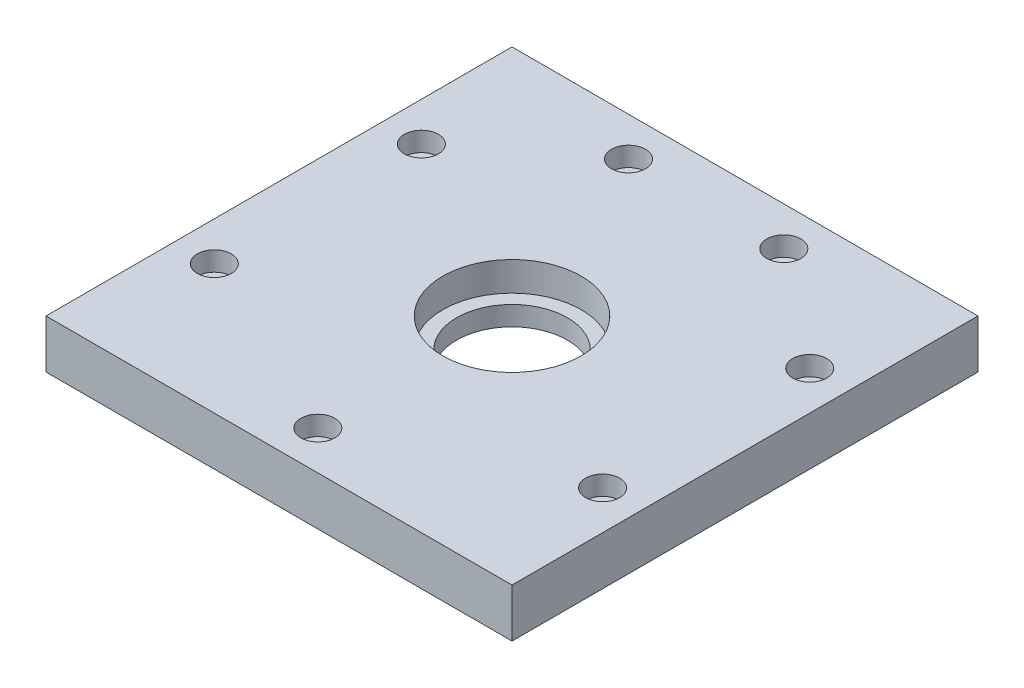
ISO-10303-21;
HEADER;
FILE_DESCRIPTION(('STEP AP214'),'2;1');
FILE_NAME('part.step','',(''),(''),'','','');
FILE_SCHEMA(('AUTOMOTIVE_DESIGN { 1 0 10303 214 1 1 1 1 }'));
ENDSEC;
DATA;
#1=APPLICATION_CONTEXT('core data for automotive mechanical design processes');
#2=APPLICATION_PROTOCOL_DEFINITION('international standard','automotive_design',2000,#1);
#3=PRODUCT_CONTEXT('',#1,'mechanical');
#4=PRODUCT('Part','Part','',(#3));
#5=PRODUCT_RELATED_PRODUCT_CATEGORY('part','',(#4));
#6=PRODUCT_DEFINITION_FORMATION('','',#4);
#7=PRODUCT_DEFINITION_CONTEXT('part definition',#1,'design');
#8=PRODUCT_DEFINITION('design','',#6,#7);
#9=PRODUCT_DEFINITION_SHAPE('','',#8);
#10=(LENGTH_UNIT() NAMED_UNIT(*) SI_UNIT(.MILLI.,.METRE.));
#11=(NAMED_UNIT(*) PLANE_ANGLE_UNIT() SI_UNIT($,.RADIAN.));
#12=(NAMED_UNIT(*) SI_UNIT($,.STERADIAN.) SOLID_ANGLE_UNIT());
#13=UNCERTAINTY_MEASURE_WITH_UNIT(LENGTH_MEASURE(1.E-05),#10,'distance_accuracy_value','');
#14=(GEOMETRIC_REPRESENTATION_CONTEXT(3) GLOBAL_UNCERTAINTY_ASSIGNED_CONTEXT((#13)) GLOBAL_UNIT_ASSIGNED_CONTEXT((#10,
#11,#12)) REPRESENTATION_CONTEXT('',''));
#15=CARTESIAN_POINT('',(0.,0.,0.));
#16=DIRECTION('',(0.,0.,1.));
#17=DIRECTION('',(1.,0.,0.));
#18=AXIS2_PLACEMENT_3D('',#15,#16,#17);
#19=CARTESIAN_POINT('',(-76.2,7.9375,76.2));
#20=DIRECTION('',(0.,-1.,0.));
#21=DIRECTION('',(0.,0.,-1.));
#22=AXIS2_PLACEMENT_3D('',#19,#20,#21);
#23=PLANE('',#22);
#24=CARTESIAN_POINT('',(-63.5,7.9375,-33.8666666666667));
#25=DIRECTION('',(0.,1.,0.));
#26=DIRECTION('',(0.,0.,1.));
#27=AXIS2_PLACEMENT_3D('',#24,#25,#26);
#28=CIRCLE('',#27,5.55625);
#29=CARTESIAN_POINT('',(-63.5,7.9375,-28.3104166666667));
#30=VERTEX_POINT('',#29);
#31=EDGE_CURVE('E210',#30,#30,#28,.T.);
#32=ORIENTED_EDGE('',*,*,#31,.F.);
#33=EDGE_LOOP('',(#32));
#34=FACE_BOUND('',#33,.T.);
#35=CARTESIAN_POINT('',(-25.4,7.9375,-63.5));
#36=DIRECTION('',(0.,1.,0.));
#37=DIRECTION('',(0.,0.,1.));
#38=AXIS2_PLACEMENT_3D('',#35,#36,#37);
#39=CIRCLE('',#38,5.55625);
#40=CARTESIAN_POINT('',(-25.4,7.9375,-57.94375));
#41=VERTEX_POINT('',#40);
#42=EDGE_CURVE('E198',#41,#41,#39,.T.);
#43=ORIENTED_EDGE('',*,*,#42,.F.);
#44=EDGE_LOOP('',(#43));
#45=FACE_BOUND('',#44,.T.);
#46=CARTESIAN_POINT('',(25.4,7.9375,-63.5));
#47=DIRECTION('',(0.,1.,0.));
#48=DIRECTION('',(0.,0.,1.));
#49=AXIS2_PLACEMENT_3D('',#46,#47,#48);
#50=CIRCLE('',#49,5.55625);
#51=CARTESIAN_POINT('',(25.4,7.9375,-57.94375));
#52=VERTEX_POINT('',#51);
#53=EDGE_CURVE('E186',#52,#52,#50,.T.);
#54=ORIENTED_EDGE('',*,*,#53,.F.);
#55=EDGE_LOOP('',(#54));
#56=FACE_BOUND('',#55,.T.);
#57=CARTESIAN_POINT('',(63.5,7.9375,-33.8666666666667));
#58=DIRECTION('',(0.,1.,0.));
#59=DIRECTION('',(0.,0.,1.));
#60=AXIS2_PLACEMENT_3D('',#57,#58,#59);
#61=CIRCLE('',#60,5.55625);
#62=CARTESIAN_POINT('',(63.5,7.9375,-28.3104166666667));
#63=VERTEX_POINT('',#62);
#64=EDGE_CURVE('E174',#63,#63,#61,.T.);
#65=ORIENTED_EDGE('',*,*,#64,.F.);
#66=EDGE_LOOP('',(#65));
#67=FACE_BOUND('',#66,.T.);
#68=CARTESIAN_POINT('',(63.5,7.9375,33.8666666666667));
#69=DIRECTION('',(0.,1.,0.));
#70=DIRECTION('',(0.,0.,1.));
#71=AXIS2_PLACEMENT_3D('',#68,#69,#70);
#72=CIRCLE('',#71,5.55625);
#73=CARTESIAN_POINT('',(63.5,7.9375,39.4229166666667));
#74=VERTEX_POINT('',#73);
#75=EDGE_CURVE('E162',#74,#74,#72,.T.);
#76=ORIENTED_EDGE('',*,*,#75,.F.);
#77=EDGE_LOOP('',(#76));
#78=FACE_BOUND('',#77,.T.);
#79=CARTESIAN_POINT('',(0.,7.9375,63.5));
#80=DIRECTION('',(0.,1.,0.));
#81=DIRECTION('',(0.,0.,1.));
#82=AXIS2_PLACEMENT_3D('',#79,#80,#81);
#83=CIRCLE('',#82,5.55625);
#84=CARTESIAN_POINT('',(0.,7.9375,69.05625));
#85=VERTEX_POINT('',#84);
#86=EDGE_CURVE('E150',#85,#85,#83,.T.);
#87=ORIENTED_EDGE('',*,*,#86,.F.);
#88=EDGE_LOOP('',(#87));
#89=FACE_BOUND('',#88,.T.);
#90=CARTESIAN_POINT('',(0.,7.9375,0.));
#91=DIRECTION('',(0.,1.,0.));
#92=DIRECTION('',(0.,0.,1.));
#93=AXIS2_PLACEMENT_3D('',#90,#91,#92);
#94=CIRCLE('',#93,22.621875);
#95=CARTESIAN_POINT('',(0.,7.9375,22.621875));
#96=VERTEX_POINT('',#95);
#97=EDGE_CURVE('E118',#96,#96,#94,.T.);
#98=ORIENTED_EDGE('',*,*,#97,.F.);
#99=EDGE_LOOP('',(#98));
#100=FACE_BOUND('',#99,.T.);
#101=DIRECTION('',(-1.,0.,0.));
#102=VECTOR('',#101,1.);
#103=CARTESIAN_POINT('',(-76.2,7.9375,-76.2));
#104=LINE('',#103,#102);
#105=CARTESIAN_POINT('',(76.2,7.9375,-76.2));
#106=VERTEX_POINT('',#105);
#107=CARTESIAN_POINT('',(-76.2,7.9375,-76.2));
#108=VERTEX_POINT('',#107);
#109=EDGE_CURVE('E80',#106,#108,#104,.T.);
#110=ORIENTED_EDGE('',*,*,#109,.T.);
#111=DIRECTION('',(0.,0.,-1.));
#112=VECTOR('',#111,1.);
#113=CARTESIAN_POINT('',(-76.2,7.9375,76.2));
#114=LINE('',#113,#112);
#115=CARTESIAN_POINT('',(-76.2,7.9375,76.2));
#116=VERTEX_POINT('',#115);
#117=EDGE_CURVE('E100',#116,#108,#114,.T.);
#118=ORIENTED_EDGE('',*,*,#117,.F.);
#119=DIRECTION('',(-1.,0.,0.));
#120=VECTOR('',#119,1.);
#121=CARTESIAN_POINT('',(-76.2,7.9375,76.2));
#122=LINE('',#121,#120);
#123=CARTESIAN_POINT('',(76.2,7.9375,76.2));
#124=VERTEX_POINT('',#123);
#125=EDGE_CURVE('E57',#124,#116,#122,.T.);
#126=ORIENTED_EDGE('',*,*,#125,.F.);
#127=DIRECTION('',(0.,0.,-1.));
#128=VECTOR('',#127,1.);
#129=CARTESIAN_POINT('',(76.2,7.9375,76.2));
#130=LINE('',#129,#128);
#131=EDGE_CURVE('E97',#124,#106,#130,.T.);
#132=ORIENTED_EDGE('',*,*,#131,.T.);
#133=EDGE_LOOP('',(#110,#118,#126,#132));
#134=FACE_BOUND('',#133,.T.);
#135=CARTESIAN_POINT('',(-63.5,7.9375,33.8666666666667));
#136=DIRECTION('',(0.,1.,0.));
#137=DIRECTION('',(0.,0.,1.));
#138=AXIS2_PLACEMENT_3D('',#135,#136,#137);
#139=CIRCLE('',#138,5.55625);
#140=CARTESIAN_POINT('',(-63.5,7.9375,39.4229166666667));
#141=VERTEX_POINT('',#140);
#142=EDGE_CURVE('E138',#141,#141,#139,.T.);
#143=ORIENTED_EDGE('',*,*,#142,.F.);
#144=EDGE_LOOP('',(#143));
#145=FACE_BOUND('',#144,.T.);
#146=ADVANCED_FACE('F40',(#34,#45,#56,#67,#78,#89,#100,#134,#145),#23,.F.);
#147=CARTESIAN_POINT('',(-76.2,-7.9375,76.2));
#148=DIRECTION('',(1.,0.,0.));
#149=DIRECTION('',(0.,0.,-1.));
#150=AXIS2_PLACEMENT_3D('',#147,#148,#149);
#151=PLANE('',#150);
#152=DIRECTION('',(0.,-1.,0.));
#153=VECTOR('',#152,1.);
#154=CARTESIAN_POINT('',(-76.2,-7.9375,-76.2));
#155=LINE('',#154,#153);
#156=CARTESIAN_POINT('',(-76.2,-7.9375,-76.2));
#157=VERTEX_POINT('',#156);
#158=EDGE_CURVE('E104',#108,#157,#155,.T.);
#159=ORIENTED_EDGE('',*,*,#158,.T.);
#160=DIRECTION('',(0.,0.,-1.));
#161=VECTOR('',#160,1.);
#162=CARTESIAN_POINT('',(-76.2,-7.9375,76.2));
#163=LINE('',#162,#161);
#164=CARTESIAN_POINT('',(-76.2,-7.9375,76.2));
#165=VERTEX_POINT('',#164);
#166=EDGE_CURVE('E11',#165,#157,#163,.T.);
#167=ORIENTED_EDGE('',*,*,#166,.F.);
#168=DIRECTION('',(0.,-1.,0.));
#169=VECTOR('',#168,1.);
#170=CARTESIAN_POINT('',(-76.2,-7.9375,76.2));
#171=LINE('',#170,#169);
#172=EDGE_CURVE('E92',#116,#165,#171,.T.);
#173=ORIENTED_EDGE('',*,*,#172,.F.);
#174=ORIENTED_EDGE('',*,*,#117,.T.);
#175=EDGE_LOOP('',(#159,#167,#173,#174));
#176=FACE_BOUND('',#175,.T.);
#177=ADVANCED_FACE('F42',(#176),#151,.F.);
#178=CARTESIAN_POINT('',(76.2,-7.9375,76.2));
#179=DIRECTION('',(0.,1.,0.));
#180=DIRECTION('',(0.,0.,1.));
#181=AXIS2_PLACEMENT_3D('',#178,#179,#180);
#182=PLANE('',#181);
#183=CARTESIAN_POINT('',(-63.5,-7.9375,-33.8666666666667));
#184=DIRECTION('',(0.,1.,0.));
#185=DIRECTION('',(0.,0.,1.));
#186=AXIS2_PLACEMENT_3D('',#183,#184,#185);
#187=CIRCLE('',#186,3.3782);
#188=CARTESIAN_POINT('',(-63.5,-7.9375,-30.4884666666667));
#189=VERTEX_POINT('',#188);
#190=EDGE_CURVE('E201',#189,#189,#187,.T.);
#191=ORIENTED_EDGE('',*,*,#190,.T.);
#192=EDGE_LOOP('',(#191));
#193=FACE_BOUND('',#192,.T.);
#194=CARTESIAN_POINT('',(-25.4,-7.9375,-63.5));
#195=DIRECTION('',(0.,1.,0.));
#196=DIRECTION('',(0.,0.,1.));
#197=AXIS2_PLACEMENT_3D('',#194,#195,#196);
#198=CIRCLE('',#197,3.3782);
#199=CARTESIAN_POINT('',(-25.4,-7.9375,-60.1218));
#200=VERTEX_POINT('',#199);
#201=EDGE_CURVE('E189',#200,#200,#198,.T.);
#202=ORIENTED_EDGE('',*,*,#201,.T.);
#203=EDGE_LOOP('',(#202));
#204=FACE_BOUND('',#203,.T.);
#205=CARTESIAN_POINT('',(25.4,-7.9375,-63.5));
#206=DIRECTION('',(0.,1.,0.));
#207=DIRECTION('',(0.,0.,1.));
#208=AXIS2_PLACEMENT_3D('',#205,#206,#207);
#209=CIRCLE('',#208,3.3782);
#210=CARTESIAN_POINT('',(25.4,-7.9375,-60.1218));
#211=VERTEX_POINT('',#210);
#212=EDGE_CURVE('E177',#211,#211,#209,.T.);
#213=ORIENTED_EDGE('',*,*,#212,.T.);
#214=EDGE_LOOP('',(#213));
#215=FACE_BOUND('',#214,.T.);
#216=CARTESIAN_POINT('',(63.5,-7.9375,-33.8666666666667));
#217=DIRECTION('',(0.,1.,0.));
#218=DIRECTION('',(0.,0.,1.));
#219=AXIS2_PLACEMENT_3D('',#216,#217,#218);
#220=CIRCLE('',#219,3.3782);
#221=CARTESIAN_POINT('',(63.5,-7.9375,-30.4884666666667));
#222=VERTEX_POINT('',#221);
#223=EDGE_CURVE('E165',#222,#222,#220,.T.);
#224=ORIENTED_EDGE('',*,*,#223,.T.);
#225=EDGE_LOOP('',(#224));
#226=FACE_BOUND('',#225,.T.);
#227=CARTESIAN_POINT('',(63.5,-7.9375,33.8666666666667));
#228=DIRECTION('',(0.,1.,0.));
#229=DIRECTION('',(0.,0.,1.));
#230=AXIS2_PLACEMENT_3D('',#227,#228,#229);
#231=CIRCLE('',#230,3.3782);
#232=CARTESIAN_POINT('',(63.5,-7.9375,37.2448666666667));
#233=VERTEX_POINT('',#232);
#234=EDGE_CURVE('E153',#233,#233,#231,.T.);
#235=ORIENTED_EDGE('',*,*,#234,.T.);
#236=EDGE_LOOP('',(#235));
#237=FACE_BOUND('',#236,.T.);
#238=CARTESIAN_POINT('',(0.,-7.9375,63.5));
#239=DIRECTION('',(0.,1.,0.));
#240=DIRECTION('',(0.,0.,1.));
#241=AXIS2_PLACEMENT_3D('',#238,#239,#240);
#242=CIRCLE('',#241,3.3782);
#243=CARTESIAN_POINT('',(0.,-7.9375,66.8782));
#244=VERTEX_POINT('',#243);
#245=EDGE_CURVE('E141',#244,#244,#242,.T.);
#246=ORIENTED_EDGE('',*,*,#245,.T.);
#247=EDGE_LOOP('',(#246));
#248=FACE_BOUND('',#247,.T.);
#249=CARTESIAN_POINT('',(-63.5,-7.9375,33.8666666666667));
#250=DIRECTION('',(0.,1.,0.));
#251=DIRECTION('',(0.,0.,1.));
#252=AXIS2_PLACEMENT_3D('',#249,#250,#251);
#253=CIRCLE('',#252,3.3782);
#254=CARTESIAN_POINT('',(-63.5,-7.9375,37.2448666666667));
#255=VERTEX_POINT('',#254);
#256=EDGE_CURVE('E127',#255,#255,#253,.T.);
#257=ORIENTED_EDGE('',*,*,#256,.T.);
#258=EDGE_LOOP('',(#257));
#259=FACE_BOUND('',#258,.T.);
#260=CARTESIAN_POINT('',(0.,-7.9375,0.));
#261=DIRECTION('',(0.,1.,0.));
#262=DIRECTION('',(0.,0.,1.));
#263=AXIS2_PLACEMENT_3D('',#260,#261,#262);
#264=CIRCLE('',#263,18.0975);
#265=CARTESIAN_POINT('',(0.,-7.9375,18.0975));
#266=VERTEX_POINT('',#265);
#267=EDGE_CURVE('E121',#266,#266,#264,.T.);
#268=ORIENTED_EDGE('',*,*,#267,.T.);
#269=EDGE_LOOP('',(#268));
#270=FACE_BOUND('',#269,.T.);
#271=DIRECTION('',(1.,0.,0.));
#272=VECTOR('',#271,1.);
#273=CARTESIAN_POINT('',(76.2,-7.9375,-76.2));
#274=LINE('',#273,#272);
#275=CARTESIAN_POINT('',(76.2,-7.9375,-76.2));
#276=VERTEX_POINT('',#275);
#277=EDGE_CURVE('E96',#157,#276,#274,.T.);
#278=ORIENTED_EDGE('',*,*,#277,.T.);
#279=DIRECTION('',(0.,0.,-1.));
#280=VECTOR('',#279,1.);
#281=CARTESIAN_POINT('',(76.2,-7.9375,76.2));
#282=LINE('',#281,#280);
#283=CARTESIAN_POINT('',(76.2,-7.9375,76.2));
#284=VERTEX_POINT('',#283);
#285=EDGE_CURVE('E49',#284,#276,#282,.T.);
#286=ORIENTED_EDGE('',*,*,#285,.F.);
#287=DIRECTION('',(1.,0.,0.));
#288=VECTOR('',#287,1.);
#289=CARTESIAN_POINT('',(76.2,-7.9375,76.2));
#290=LINE('',#289,#288);
#291=EDGE_CURVE('E87',#165,#284,#290,.T.);
#292=ORIENTED_EDGE('',*,*,#291,.F.);
#293=ORIENTED_EDGE('',*,*,#166,.T.);
#294=EDGE_LOOP('',(#278,#286,#292,#293));
#295=FACE_BOUND('',#294,.T.);
#296=ADVANCED_FACE('F95',(#193,#204,#215,#226,#237,#248,#259,#270,#295),#182,.F.);
#297=CARTESIAN_POINT('',(76.2,7.9375,76.2));
#298=DIRECTION('',(-1.,0.,0.));
#299=DIRECTION('',(0.,0.,1.));
#300=AXIS2_PLACEMENT_3D('',#297,#298,#299);
#301=PLANE('',#300);
#302=DIRECTION('',(0.,1.,0.));
#303=VECTOR('',#302,1.);
#304=CARTESIAN_POINT('',(76.2,7.9375,-76.2));
#305=LINE('',#304,#303);
#306=EDGE_CURVE('E74',#276,#106,#305,.T.);
#307=ORIENTED_EDGE('',*,*,#306,.T.);
#308=ORIENTED_EDGE('',*,*,#131,.F.);
#309=DIRECTION('',(0.,1.,0.));
#310=VECTOR('',#309,1.);
#311=CARTESIAN_POINT('',(76.2,7.9375,76.2));
#312=LINE('',#311,#310);
#313=EDGE_CURVE('E90',#284,#124,#312,.T.);
#314=ORIENTED_EDGE('',*,*,#313,.F.);
#315=ORIENTED_EDGE('',*,*,#285,.T.);
#316=EDGE_LOOP('',(#307,#308,#314,#315));
#317=FACE_BOUND('',#316,.T.);
#318=ADVANCED_FACE('F98',(#317),#301,.F.);
#319=CARTESIAN_POINT('',(0.,0.,76.2));
#320=DIRECTION('',(0.,0.,-1.));
#321=DIRECTION('',(-1.,0.,0.));
#322=AXIS2_PLACEMENT_3D('',#319,#320,#321);
#323=PLANE('',#322);
#324=ORIENTED_EDGE('',*,*,#172,.T.);
#325=ORIENTED_EDGE('',*,*,#291,.T.);
#326=ORIENTED_EDGE('',*,*,#313,.T.);
#327=ORIENTED_EDGE('',*,*,#125,.T.);
#328=EDGE_LOOP('',(#324,#325,#326,#327));
#329=FACE_BOUND('',#328,.T.);
#330=ADVANCED_FACE('F88',(#329),#323,.F.);
#331=CARTESIAN_POINT('',(0.,0.,-76.2));
#332=DIRECTION('',(0.,0.,-1.));
#333=DIRECTION('',(-1.,0.,0.));
#334=AXIS2_PLACEMENT_3D('',#331,#332,#333);
#335=PLANE('',#334);
#336=ORIENTED_EDGE('',*,*,#158,.F.);
#337=ORIENTED_EDGE('',*,*,#109,.F.);
#338=ORIENTED_EDGE('',*,*,#306,.F.);
#339=ORIENTED_EDGE('',*,*,#277,.F.);
#340=EDGE_LOOP('',(#336,#337,#338,#339));
#341=FACE_BOUND('',#340,.T.);
#342=ADVANCED_FACE('F115',(#341),#335,.T.);
#343=CARTESIAN_POINT('',(0.,-1.5875,0.));
#344=DIRECTION('',(0.,1.,0.));
#345=DIRECTION('',(0.,0.,1.));
#346=AXIS2_PLACEMENT_3D('',#343,#344,#345);
#347=CYLINDRICAL_SURFACE('',#346,22.621875);
#348=CARTESIAN_POINT('',(0.,-1.5875,0.));
#349=DIRECTION('',(0.,1.,0.));
#350=DIRECTION('',(0.,0.,1.));
#351=AXIS2_PLACEMENT_3D('',#348,#349,#350);
#352=CIRCLE('',#351,22.621875);
#353=CARTESIAN_POINT('',(0.,-1.5875,22.621875));
#354=VERTEX_POINT('',#353);
#355=EDGE_CURVE('E107',#354,#354,#352,.T.);
#356=CARTESIAN_POINT('',(0.,-1.5875,22.621875));
#357=CARTESIAN_POINT('',(0.,-1.48828125,22.621875));
#358=CARTESIAN_POINT('',(0.,-1.3890625,22.621875));
#359=CARTESIAN_POINT('',(0.,-1.190625,22.621875));
#360=CARTESIAN_POINT('',(0.,-1.09140625,22.621875));
#361=CARTESIAN_POINT('',(0.,-0.892968749999999,22.621875));
#362=CARTESIAN_POINT('',(0.,-0.793749999999999,22.621875));
#363=CARTESIAN_POINT('',(0.,-0.595312499999999,22.621875));
#364=CARTESIAN_POINT('',(0.,-0.496093749999999,22.621875));
#365=CARTESIAN_POINT('',(0.,-0.297656249999999,22.621875));
#366=CARTESIAN_POINT('',(0.,-0.198437499999998,22.621875));
#367=CARTESIAN_POINT('',(0.,0.,22.621875));
#368=CARTESIAN_POINT('',(0.,0.0992187500000016,22.621875));
#369=CARTESIAN_POINT('',(0.,0.297656250000001,22.621875));
#370=CARTESIAN_POINT('',(0.,0.396875000000001,22.621875));
#371=CARTESIAN_POINT('',(0.,0.595312500000001,22.621875));
#372=CARTESIAN_POINT('',(0.,0.694531250000001,22.621875));
#373=CARTESIAN_POINT('',(0.,0.892968750000002,22.621875));
#374=CARTESIAN_POINT('',(0.,0.992187500000002,22.621875));
#375=CARTESIAN_POINT('',(0.,1.190625,22.621875));
#376=CARTESIAN_POINT('',(0.,1.28984375,22.621875));
#377=CARTESIAN_POINT('',(0.,1.48828125,22.621875));
#378=CARTESIAN_POINT('',(0.,1.5875,22.621875));
#379=CARTESIAN_POINT('',(0.,1.7859375,22.621875));
#380=CARTESIAN_POINT('',(0.,1.88515625,22.621875));
#381=CARTESIAN_POINT('',(0.,2.08359375,22.621875));
#382=CARTESIAN_POINT('',(0.,2.1828125,22.621875));
#383=CARTESIAN_POINT('',(0.,2.38125,22.621875));
#384=CARTESIAN_POINT('',(0.,2.48046875,22.621875));
#385=CARTESIAN_POINT('',(0.,2.67890625,22.621875));
#386=CARTESIAN_POINT('',(0.,2.778125,22.621875));
#387=CARTESIAN_POINT('',(0.,2.9765625,22.621875));
#388=CARTESIAN_POINT('',(0.,3.07578125,22.621875));
#389=CARTESIAN_POINT('',(0.,3.27421875,22.621875));
#390=CARTESIAN_POINT('',(0.,3.3734375,22.621875));
#391=CARTESIAN_POINT('',(0.,3.571875,22.621875));
#392=CARTESIAN_POINT('',(0.,3.67109375,22.621875));
#393=CARTESIAN_POINT('',(0.,3.86953125,22.621875));
#394=CARTESIAN_POINT('',(0.,3.96875,22.621875));
#395=CARTESIAN_POINT('',(0.,4.1671875,22.621875));
#396=CARTESIAN_POINT('',(0.,4.26640625,22.621875));
#397=CARTESIAN_POINT('',(0.,4.46484375,22.621875));
#398=CARTESIAN_POINT('',(0.,4.5640625,22.621875));
#399=CARTESIAN_POINT('',(0.,4.7625,22.621875));
#400=CARTESIAN_POINT('',(0.,4.86171875,22.621875));
#401=CARTESIAN_POINT('',(0.,5.06015625,22.621875));
#402=CARTESIAN_POINT('',(0.,5.159375,22.621875));
#403=CARTESIAN_POINT('',(0.,5.3578125,22.621875));
#404=CARTESIAN_POINT('',(0.,5.45703125,22.621875));
#405=CARTESIAN_POINT('',(0.,5.65546875,22.621875));
#406=CARTESIAN_POINT('',(0.,5.7546875,22.621875));
#407=CARTESIAN_POINT('',(0.,5.953125,22.621875));
#408=CARTESIAN_POINT('',(0.,6.05234375,22.621875));
#409=CARTESIAN_POINT('',(0.,6.25078125,22.621875));
#410=CARTESIAN_POINT('',(0.,6.35,22.621875));
#411=CARTESIAN_POINT('',(0.,6.5484375,22.621875));
#412=CARTESIAN_POINT('',(0.,6.64765625,22.621875));
#413=CARTESIAN_POINT('',(0.,6.84609375,22.621875));
#414=CARTESIAN_POINT('',(0.,6.9453125,22.621875));
#415=CARTESIAN_POINT('',(0.,7.14375,22.621875));
#416=CARTESIAN_POINT('',(0.,7.24296875,22.621875));
#417=CARTESIAN_POINT('',(0.,7.44140625,22.621875));
#418=CARTESIAN_POINT('',(0.,7.540625,22.621875));
#419=CARTESIAN_POINT('',(0.,7.7390625,22.621875));
#420=CARTESIAN_POINT('',(0.,7.83828125,22.621875));
#421=CARTESIAN_POINT('',(0.,7.9375,22.621875));
#422=B_SPLINE_CURVE_WITH_KNOTS('',3,(#356,#357,#358,#359,#360,#361,#362,#363,#364,#365,#366,
#367,#368,#369,#370,#371,#372,#373,#374,#375,#376,#377,#378,#379,#380,#381,#382,#383,#384,#385,
#386,#387,#388,#389,#390,#391,#392,#393,#394,#395,#396,#397,#398,#399,#400,#401,#402,#403,#404,
#405,#406,#407,#408,#409,#410,#411,#412,#413,#414,#415,#416,#417,#418,#419,#420,#421),
.UNSPECIFIED.,.F.,.F.,(4,2,2,2,2,2,2,2,2,2,2,2,2,2,2,2,2,2,2,2,2,2,2,2,2,2,2,2,2,2,2,2,4),(0.,
0.29765625,0.5953125,0.89296875,1.190625,1.48828125,1.7859375,2.08359375,2.38125,2.67890625,
2.9765625,3.27421875,3.571875,3.86953125,4.1671875,4.46484375,4.7625,5.06015625,5.3578125,
5.65546875,5.953125,6.25078125,6.5484375,6.84609375,7.14375,7.44140625,7.7390625,8.03671875,
8.334375,8.63203125,8.9296875,9.22734375,9.525),.UNSPECIFIED.);
#423=EDGE_CURVE('BSEAM231',#354,#96,#422,.T.);
#424=ORIENTED_EDGE('',*,*,#355,.F.);
#425=ORIENTED_EDGE('',*,*,#97,.T.);
#426=ORIENTED_EDGE('',*,*,#423,.T.);
#427=ORIENTED_EDGE('',*,*,#423,.F.);
#428=EDGE_LOOP('',(#424,#426,#425,#427));
#429=FACE_BOUND('',#428,.T.);
#430=ADVANCED_FACE('F231',(#429),#347,.F.);
#431=CARTESIAN_POINT('',(0.,-1.5875,0.));
#432=DIRECTION('',(0.,1.,0.));
#433=DIRECTION('',(0.,0.,1.));
#434=AXIS2_PLACEMENT_3D('',#431,#432,#433);
#435=PLANE('',#434);
#436=CARTESIAN_POINT('',(0.,-1.5875,0.));
#437=DIRECTION('',(0.,1.,0.));
#438=DIRECTION('',(0.,0.,1.));
#439=AXIS2_PLACEMENT_3D('',#436,#437,#438);
#440=CIRCLE('',#439,18.0975);
#441=CARTESIAN_POINT('',(0.,-1.5875,18.0975));
#442=VERTEX_POINT('',#441);
#443=EDGE_CURVE('E124',#442,#442,#440,.T.);
#444=ORIENTED_EDGE('',*,*,#443,.F.);
#445=EDGE_LOOP('',(#444));
#446=FACE_BOUND('',#445,.T.);
#447=ORIENTED_EDGE('',*,*,#355,.T.);
#448=EDGE_LOOP('',(#447));
#449=FACE_BOUND('',#448,.T.);
#450=ADVANCED_FACE('F233',(#446,#449),#435,.T.);
#451=CARTESIAN_POINT('',(0.,-7.9375,0.));
#452=DIRECTION('',(0.,1.,0.));
#453=DIRECTION('',(0.,0.,1.));
#454=AXIS2_PLACEMENT_3D('',#451,#452,#453);
#455=CYLINDRICAL_SURFACE('',#454,18.0975);
#456=ORIENTED_EDGE('',*,*,#267,.F.);
#457=EDGE_LOOP('',(#456));
#458=FACE_BOUND('',#457,.T.);
#459=ORIENTED_EDGE('',*,*,#443,.T.);
#460=EDGE_LOOP('',(#459));
#461=FACE_BOUND('',#460,.T.);
#462=ADVANCED_FACE('F240',(#458,#461),#455,.F.);
#463=CARTESIAN_POINT('',(-63.5,7.9375,33.8666666666667));
#464=DIRECTION('',(0.,1.,0.));
#465=DIRECTION('',(0.,0.,1.));
#466=AXIS2_PLACEMENT_3D('',#463,#464,#465);
#467=CYLINDRICAL_SURFACE('',#466,3.3782);
#468=ORIENTED_EDGE('',*,*,#256,.F.);
#469=EDGE_LOOP('',(#468));
#470=FACE_BOUND('',#469,.T.);
#471=CARTESIAN_POINT('',(-63.5,1.5875,33.8666666666667));
#472=DIRECTION('',(0.,1.,0.));
#473=DIRECTION('',(0.,0.,1.));
#474=AXIS2_PLACEMENT_3D('',#471,#472,#473);
#475=CIRCLE('',#474,3.3782);
#476=CARTESIAN_POINT('',(-63.5,1.5875,37.2448666666667));
#477=VERTEX_POINT('',#476);
#478=EDGE_CURVE('E132',#477,#477,#475,.T.);
#479=ORIENTED_EDGE('',*,*,#478,.T.);
#480=EDGE_LOOP('',(#479));
#481=FACE_BOUND('',#480,.T.);
#482=ADVANCED_FACE('F273',(#470,#481),#467,.F.);
#483=CARTESIAN_POINT('',(-60.1218,1.5875,33.8666666666667));
#484=DIRECTION('',(0.,-1.,0.));
#485=DIRECTION('',(0.,0.,-1.));
#486=AXIS2_PLACEMENT_3D('',#483,#484,#485);
#487=PLANE('',#486);
#488=ORIENTED_EDGE('',*,*,#478,.F.);
#489=EDGE_LOOP('',(#488));
#490=FACE_BOUND('',#489,.T.);
#491=CARTESIAN_POINT('',(-63.5,1.5875,33.8666666666667));
#492=DIRECTION('',(0.,1.,0.));
#493=DIRECTION('',(0.,0.,1.));
#494=AXIS2_PLACEMENT_3D('',#491,#492,#493);
#495=CIRCLE('',#494,5.55625);
#496=CARTESIAN_POINT('',(-63.5,1.5875,39.4229166666667));
#497=VERTEX_POINT('',#496);
#498=EDGE_CURVE('E135',#497,#497,#495,.T.);
#499=ORIENTED_EDGE('',*,*,#498,.T.);
#500=EDGE_LOOP('',(#499));
#501=FACE_BOUND('',#500,.T.);
#502=ADVANCED_FACE('F279',(#490,#501),#487,.F.);
#503=CARTESIAN_POINT('',(-63.5,7.9375,33.8666666666667));
#504=DIRECTION('',(0.,1.,0.));
#505=DIRECTION('',(0.,0.,1.));
#506=AXIS2_PLACEMENT_3D('',#503,#504,#505);
#507=CYLINDRICAL_SURFACE('',#506,5.55625);
#508=ORIENTED_EDGE('',*,*,#498,.F.);
#509=EDGE_LOOP('',(#508));
#510=FACE_BOUND('',#509,.T.);
#511=ORIENTED_EDGE('',*,*,#142,.T.);
#512=EDGE_LOOP('',(#511));
#513=FACE_BOUND('',#512,.T.);
#514=ADVANCED_FACE('F285',(#510,#513),#507,.F.);
#515=CARTESIAN_POINT('',(0.,7.9375,63.5));
#516=DIRECTION('',(0.,1.,0.));
#517=DIRECTION('',(0.,0.,1.));
#518=AXIS2_PLACEMENT_3D('',#515,#516,#517);
#519=CYLINDRICAL_SURFACE('',#518,3.3782);
#520=ORIENTED_EDGE('',*,*,#245,.F.);
#521=EDGE_LOOP('',(#520));
#522=FACE_BOUND('',#521,.T.);
#523=CARTESIAN_POINT('',(0.,1.5875,63.5));
#524=DIRECTION('',(0.,1.,0.));
#525=DIRECTION('',(0.,0.,1.));
#526=AXIS2_PLACEMENT_3D('',#523,#524,#525);
#527=CIRCLE('',#526,3.3782);
#528=CARTESIAN_POINT('',(0.,1.5875,66.8782));
#529=VERTEX_POINT('',#528);
#530=EDGE_CURVE('E144',#529,#529,#527,.T.);
#531=ORIENTED_EDGE('',*,*,#530,.T.);
#532=EDGE_LOOP('',(#531));
#533=FACE_BOUND('',#532,.T.);
#534=ADVANCED_FACE('F289',(#522,#533),#519,.F.);
#535=CARTESIAN_POINT('',(3.3782,1.5875,63.5));
#536=DIRECTION('',(0.,-1.,0.));
#537=DIRECTION('',(0.,0.,-1.));
#538=AXIS2_PLACEMENT_3D('',#535,#536,#537);
#539=PLANE('',#538);
#540=ORIENTED_EDGE('',*,*,#530,.F.);
#541=EDGE_LOOP('',(#540));
#542=FACE_BOUND('',#541,.T.);
#543=CARTESIAN_POINT('',(0.,1.5875,63.5));
#544=DIRECTION('',(0.,1.,0.));
#545=DIRECTION('',(0.,0.,1.));
#546=AXIS2_PLACEMENT_3D('',#543,#544,#545);
#547=CIRCLE('',#546,5.55625);
#548=CARTESIAN_POINT('',(0.,1.5875,69.05625));
#549=VERTEX_POINT('',#548);
#550=EDGE_CURVE('E147',#549,#549,#547,.T.);
#551=ORIENTED_EDGE('',*,*,#550,.T.);
#552=EDGE_LOOP('',(#551));
#553=FACE_BOUND('',#552,.T.);
#554=ADVANCED_FACE('F293',(#542,#553),#539,.F.);
#555=CARTESIAN_POINT('',(0.,7.9375,63.5));
#556=DIRECTION('',(0.,1.,0.));
#557=DIRECTION('',(0.,0.,1.));
#558=AXIS2_PLACEMENT_3D('',#555,#556,#557);
#559=CYLINDRICAL_SURFACE('',#558,5.55625);
#560=ORIENTED_EDGE('',*,*,#550,.F.);
#561=EDGE_LOOP('',(#560));
#562=FACE_BOUND('',#561,.T.);
#563=ORIENTED_EDGE('',*,*,#86,.T.);
#564=EDGE_LOOP('',(#563));
#565=FACE_BOUND('',#564,.T.);
#566=ADVANCED_FACE('F297',(#562,#565),#559,.F.);
#567=CARTESIAN_POINT('',(63.5,7.9375,33.8666666666667));
#568=DIRECTION('',(0.,1.,0.));
#569=DIRECTION('',(0.,0.,1.));
#570=AXIS2_PLACEMENT_3D('',#567,#568,#569);
#571=CYLINDRICAL_SURFACE('',#570,3.3782);
#572=ORIENTED_EDGE('',*,*,#234,.F.);
#573=EDGE_LOOP('',(#572));
#574=FACE_BOUND('',#573,.T.);
#575=CARTESIAN_POINT('',(63.5,1.5875,33.8666666666667));
#576=DIRECTION('',(0.,1.,0.));
#577=DIRECTION('',(0.,0.,1.));
#578=AXIS2_PLACEMENT_3D('',#575,#576,#577);
#579=CIRCLE('',#578,3.3782);
#580=CARTESIAN_POINT('',(63.5,1.5875,37.2448666666667));
#581=VERTEX_POINT('',#580);
#582=EDGE_CURVE('E156',#581,#581,#579,.T.);
#583=ORIENTED_EDGE('',*,*,#582,.T.);
#584=EDGE_LOOP('',(#583));
#585=FACE_BOUND('',#584,.T.);
#586=ADVANCED_FACE('F301',(#574,#585),#571,.F.);
#587=CARTESIAN_POINT('',(66.8782,1.5875,33.8666666666667));
#588=DIRECTION('',(0.,-1.,0.));
#589=DIRECTION('',(0.,0.,-1.));
#590=AXIS2_PLACEMENT_3D('',#587,#588,#589);
#591=PLANE('',#590);
#592=ORIENTED_EDGE('',*,*,#582,.F.);
#593=EDGE_LOOP('',(#592));
#594=FACE_BOUND('',#593,.T.);
#595=CARTESIAN_POINT('',(63.5,1.5875,33.8666666666667));
#596=DIRECTION('',(0.,1.,0.));
#597=DIRECTION('',(0.,0.,1.));
#598=AXIS2_PLACEMENT_3D('',#595,#596,#597);
#599=CIRCLE('',#598,5.55625);
#600=CARTESIAN_POINT('',(63.5,1.5875,39.4229166666667));
#601=VERTEX_POINT('',#600);
#602=EDGE_CURVE('E159',#601,#601,#599,.T.);
#603=ORIENTED_EDGE('',*,*,#602,.T.);
#604=EDGE_LOOP('',(#603));
#605=FACE_BOUND('',#604,.T.);
#606=ADVANCED_FACE('F305',(#594,#605),#591,.F.);
#607=CARTESIAN_POINT('',(63.5,7.9375,33.8666666666667));
#608=DIRECTION('',(0.,1.,0.));
#609=DIRECTION('',(0.,0.,1.));
#610=AXIS2_PLACEMENT_3D('',#607,#608,#609);
#611=CYLINDRICAL_SURFACE('',#610,5.55625);
#612=ORIENTED_EDGE('',*,*,#602,.F.);
#613=EDGE_LOOP('',(#612));
#614=FACE_BOUND('',#613,.T.);
#615=ORIENTED_EDGE('',*,*,#75,.T.);
#616=EDGE_LOOP('',(#615));
#617=FACE_BOUND('',#616,.T.);
#618=ADVANCED_FACE('F309',(#614,#617),#611,.F.);
#619=CARTESIAN_POINT('',(63.5,7.9375,-33.8666666666667));
#620=DIRECTION('',(0.,1.,0.));
#621=DIRECTION('',(0.,0.,1.));
#622=AXIS2_PLACEMENT_3D('',#619,#620,#621);
#623=CYLINDRICAL_SURFACE('',#622,3.3782);
#624=ORIENTED_EDGE('',*,*,#223,.F.);
#625=EDGE_LOOP('',(#624));
#626=FACE_BOUND('',#625,.T.);
#627=CARTESIAN_POINT('',(63.5,1.5875,-33.8666666666667));
#628=DIRECTION('',(0.,1.,0.));
#629=DIRECTION('',(0.,0.,1.));
#630=AXIS2_PLACEMENT_3D('',#627,#628,#629);
#631=CIRCLE('',#630,3.3782);
#632=CARTESIAN_POINT('',(63.5,1.5875,-30.4884666666667));
#633=VERTEX_POINT('',#632);
#634=EDGE_CURVE('E168',#633,#633,#631,.T.);
#635=ORIENTED_EDGE('',*,*,#634,.T.);
#636=EDGE_LOOP('',(#635));
#637=FACE_BOUND('',#636,.T.);
#638=ADVANCED_FACE('F313',(#626,#637),#623,.F.);
#639=CARTESIAN_POINT('',(66.8782,1.5875,-33.8666666666667));
#640=DIRECTION('',(0.,-1.,0.));
#641=DIRECTION('',(0.,0.,-1.));
#642=AXIS2_PLACEMENT_3D('',#639,#640,#641);
#643=PLANE('',#642);
#644=ORIENTED_EDGE('',*,*,#634,.F.);
#645=EDGE_LOOP('',(#644));
#646=FACE_BOUND('',#645,.T.);
#647=CARTESIAN_POINT('',(63.5,1.5875,-33.8666666666667));
#648=DIRECTION('',(0.,1.,0.));
#649=DIRECTION('',(0.,0.,1.));
#650=AXIS2_PLACEMENT_3D('',#647,#648,#649);
#651=CIRCLE('',#650,5.55625);
#652=CARTESIAN_POINT('',(63.5,1.5875,-28.3104166666667));
#653=VERTEX_POINT('',#652);
#654=EDGE_CURVE('E171',#653,#653,#651,.T.);
#655=ORIENTED_EDGE('',*,*,#654,.T.);
#656=EDGE_LOOP('',(#655));
#657=FACE_BOUND('',#656,.T.);
#658=ADVANCED_FACE('F317',(#646,#657),#643,.F.);
#659=CARTESIAN_POINT('',(63.5,7.9375,-33.8666666666667));
#660=DIRECTION('',(0.,1.,0.));
#661=DIRECTION('',(0.,0.,1.));
#662=AXIS2_PLACEMENT_3D('',#659,#660,#661);
#663=CYLINDRICAL_SURFACE('',#662,5.55625);
#664=ORIENTED_EDGE('',*,*,#654,.F.);
#665=EDGE_LOOP('',(#664));
#666=FACE_BOUND('',#665,.T.);
#667=ORIENTED_EDGE('',*,*,#64,.T.);
#668=EDGE_LOOP('',(#667));
#669=FACE_BOUND('',#668,.T.);
#670=ADVANCED_FACE('F321',(#666,#669),#663,.F.);
#671=CARTESIAN_POINT('',(25.4,7.9375,-63.5));
#672=DIRECTION('',(0.,1.,0.));
#673=DIRECTION('',(0.,0.,1.));
#674=AXIS2_PLACEMENT_3D('',#671,#672,#673);
#675=CYLINDRICAL_SURFACE('',#674,3.3782);
#676=ORIENTED_EDGE('',*,*,#212,.F.);
#677=EDGE_LOOP('',(#676));
#678=FACE_BOUND('',#677,.T.);
#679=CARTESIAN_POINT('',(25.4,1.5875,-63.5));
#680=DIRECTION('',(0.,1.,0.));
#681=DIRECTION('',(0.,0.,1.));
#682=AXIS2_PLACEMENT_3D('',#679,#680,#681);
#683=CIRCLE('',#682,3.3782);
#684=CARTESIAN_POINT('',(25.4,1.5875,-60.1218));
#685=VERTEX_POINT('',#684);
#686=EDGE_CURVE('E180',#685,#685,#683,.T.);
#687=ORIENTED_EDGE('',*,*,#686,.T.);
#688=EDGE_LOOP('',(#687));
#689=FACE_BOUND('',#688,.T.);
#690=ADVANCED_FACE('F325',(#678,#689),#675,.F.);
#691=CARTESIAN_POINT('',(28.7782,1.5875,-63.5));
#692=DIRECTION('',(0.,-1.,0.));
#693=DIRECTION('',(0.,0.,-1.));
#694=AXIS2_PLACEMENT_3D('',#691,#692,#693);
#695=PLANE('',#694);
#696=ORIENTED_EDGE('',*,*,#686,.F.);
#697=EDGE_LOOP('',(#696));
#698=FACE_BOUND('',#697,.T.);
#699=CARTESIAN_POINT('',(25.4,1.5875,-63.5));
#700=DIRECTION('',(0.,1.,0.));
#701=DIRECTION('',(0.,0.,1.));
#702=AXIS2_PLACEMENT_3D('',#699,#700,#701);
#703=CIRCLE('',#702,5.55625);
#704=CARTESIAN_POINT('',(25.4,1.5875,-57.94375));
#705=VERTEX_POINT('',#704);
#706=EDGE_CURVE('E183',#705,#705,#703,.T.);
#707=ORIENTED_EDGE('',*,*,#706,.T.);
#708=EDGE_LOOP('',(#707));
#709=FACE_BOUND('',#708,.T.);
#710=ADVANCED_FACE('F329',(#698,#709),#695,.F.);
#711=CARTESIAN_POINT('',(25.4,7.9375,-63.5));
#712=DIRECTION('',(0.,1.,0.));
#713=DIRECTION('',(0.,0.,1.));
#714=AXIS2_PLACEMENT_3D('',#711,#712,#713);
#715=CYLINDRICAL_SURFACE('',#714,5.55625);
#716=ORIENTED_EDGE('',*,*,#706,.F.);
#717=EDGE_LOOP('',(#716));
#718=FACE_BOUND('',#717,.T.);
#719=ORIENTED_EDGE('',*,*,#53,.T.);
#720=EDGE_LOOP('',(#719));
#721=FACE_BOUND('',#720,.T.);
#722=ADVANCED_FACE('F333',(#718,#721),#715,.F.);
#723=CARTESIAN_POINT('',(-25.4,7.9375,-63.5));
#724=DIRECTION('',(0.,1.,0.));
#725=DIRECTION('',(0.,0.,1.));
#726=AXIS2_PLACEMENT_3D('',#723,#724,#725);
#727=CYLINDRICAL_SURFACE('',#726,3.3782);
#728=ORIENTED_EDGE('',*,*,#201,.F.);
#729=EDGE_LOOP('',(#728));
#730=FACE_BOUND('',#729,.T.);
#731=CARTESIAN_POINT('',(-25.4,1.5875,-63.5));
#732=DIRECTION('',(0.,1.,0.));
#733=DIRECTION('',(0.,0.,1.));
#734=AXIS2_PLACEMENT_3D('',#731,#732,#733);
#735=CIRCLE('',#734,3.3782);
#736=CARTESIAN_POINT('',(-25.4,1.5875,-60.1218));
#737=VERTEX_POINT('',#736);
#738=EDGE_CURVE('E192',#737,#737,#735,.T.);
#739=ORIENTED_EDGE('',*,*,#738,.T.);
#740=EDGE_LOOP('',(#739));
#741=FACE_BOUND('',#740,.T.);
#742=ADVANCED_FACE('F337',(#730,#741),#727,.F.);
#743=CARTESIAN_POINT('',(-22.0218,1.5875,-63.5));
#744=DIRECTION('',(0.,-1.,0.));
#745=DIRECTION('',(0.,0.,-1.));
#746=AXIS2_PLACEMENT_3D('',#743,#744,#745);
#747=PLANE('',#746);
#748=ORIENTED_EDGE('',*,*,#738,.F.);
#749=EDGE_LOOP('',(#748));
#750=FACE_BOUND('',#749,.T.);
#751=CARTESIAN_POINT('',(-25.4,1.5875,-63.5));
#752=DIRECTION('',(0.,1.,0.));
#753=DIRECTION('',(0.,0.,1.));
#754=AXIS2_PLACEMENT_3D('',#751,#752,#753);
#755=CIRCLE('',#754,5.55625);
#756=CARTESIAN_POINT('',(-25.4,1.5875,-57.94375));
#757=VERTEX_POINT('',#756);
#758=EDGE_CURVE('E195',#757,#757,#755,.T.);
#759=ORIENTED_EDGE('',*,*,#758,.T.);
#760=EDGE_LOOP('',(#759));
#761=FACE_BOUND('',#760,.T.);
#762=ADVANCED_FACE('F341',(#750,#761),#747,.F.);
#763=CARTESIAN_POINT('',(-25.4,7.9375,-63.5));
#764=DIRECTION('',(0.,1.,0.));
#765=DIRECTION('',(0.,0.,1.));
#766=AXIS2_PLACEMENT_3D('',#763,#764,#765);
#767=CYLINDRICAL_SURFACE('',#766,5.55625);
#768=ORIENTED_EDGE('',*,*,#758,.F.);
#769=EDGE_LOOP('',(#768));
#770=FACE_BOUND('',#769,.T.);
#771=ORIENTED_EDGE('',*,*,#42,.T.);
#772=EDGE_LOOP('',(#771));
#773=FACE_BOUND('',#772,.T.);
#774=ADVANCED_FACE('F345',(#770,#773),#767,.F.);
#775=CARTESIAN_POINT('',(-63.5,7.9375,-33.8666666666667));
#776=DIRECTION('',(0.,1.,0.));
#777=DIRECTION('',(0.,0.,1.));
#778=AXIS2_PLACEMENT_3D('',#775,#776,#777);
#779=CYLINDRICAL_SURFACE('',#778,3.3782);
#780=ORIENTED_EDGE('',*,*,#190,.F.);
#781=EDGE_LOOP('',(#780));
#782=FACE_BOUND('',#781,.T.);
#783=CARTESIAN_POINT('',(-63.5,1.5875,-33.8666666666667));
#784=DIRECTION('',(0.,1.,0.));
#785=DIRECTION('',(0.,0.,1.));
#786=AXIS2_PLACEMENT_3D('',#783,#784,#785);
#787=CIRCLE('',#786,3.3782);
#788=CARTESIAN_POINT('',(-63.5,1.5875,-30.4884666666667));
#789=VERTEX_POINT('',#788);
#790=EDGE_CURVE('E204',#789,#789,#787,.T.);
#791=ORIENTED_EDGE('',*,*,#790,.T.);
#792=EDGE_LOOP('',(#791));
#793=FACE_BOUND('',#792,.T.);
#794=ADVANCED_FACE('F349',(#782,#793),#779,.F.);
#795=CARTESIAN_POINT('',(-60.1218,1.5875,-33.8666666666667));
#796=DIRECTION('',(0.,-1.,0.));
#797=DIRECTION('',(0.,0.,-1.));
#798=AXIS2_PLACEMENT_3D('',#795,#796,#797);
#799=PLANE('',#798);
#800=ORIENTED_EDGE('',*,*,#790,.F.);
#801=EDGE_LOOP('',(#800));
#802=FACE_BOUND('',#801,.T.);
#803=CARTESIAN_POINT('',(-63.5,1.5875,-33.8666666666667));
#804=DIRECTION('',(0.,1.,0.));
#805=DIRECTION('',(0.,0.,1.));
#806=AXIS2_PLACEMENT_3D('',#803,#804,#805);
#807=CIRCLE('',#806,5.55625);
#808=CARTESIAN_POINT('',(-63.5,1.5875,-28.3104166666667));
#809=VERTEX_POINT('',#808);
#810=EDGE_CURVE('E207',#809,#809,#807,.T.);
#811=ORIENTED_EDGE('',*,*,#810,.T.);
#812=EDGE_LOOP('',(#811));
#813=FACE_BOUND('',#812,.T.);
#814=ADVANCED_FACE('F353',(#802,#813),#799,.F.);
#815=CARTESIAN_POINT('',(-63.5,7.9375,-33.8666666666667));
#816=DIRECTION('',(0.,1.,0.));
#817=DIRECTION('',(0.,0.,1.));
#818=AXIS2_PLACEMENT_3D('',#815,#816,#817);
#819=CYLINDRICAL_SURFACE('',#818,5.55625);
#820=ORIENTED_EDGE('',*,*,#810,.F.);
#821=EDGE_LOOP('',(#820));
#822=FACE_BOUND('',#821,.T.);
#823=ORIENTED_EDGE('',*,*,#31,.T.);
#824=EDGE_LOOP('',(#823));
#825=FACE_BOUND('',#824,.T.);
#826=ADVANCED_FACE('F214',(#822,#825),#819,.F.);
#827=CLOSED_SHELL('',(#146,#177,#296,#318,#330,#342,#430,#450,#462,#482,#502,#514,#534,#554,
#566,#586,#606,#618,#638,#658,#670,#690,#710,#722,#742,#762,#774,#794,#814,#826));
#828=MANIFOLD_SOLID_BREP('B2',#827);
#829=ADVANCED_BREP_SHAPE_REPRESENTATION('',(#18,#828),#14);
#830=SHAPE_DEFINITION_REPRESENTATION(#9,#829);
ENDSEC;
END-ISO-10303-21;
